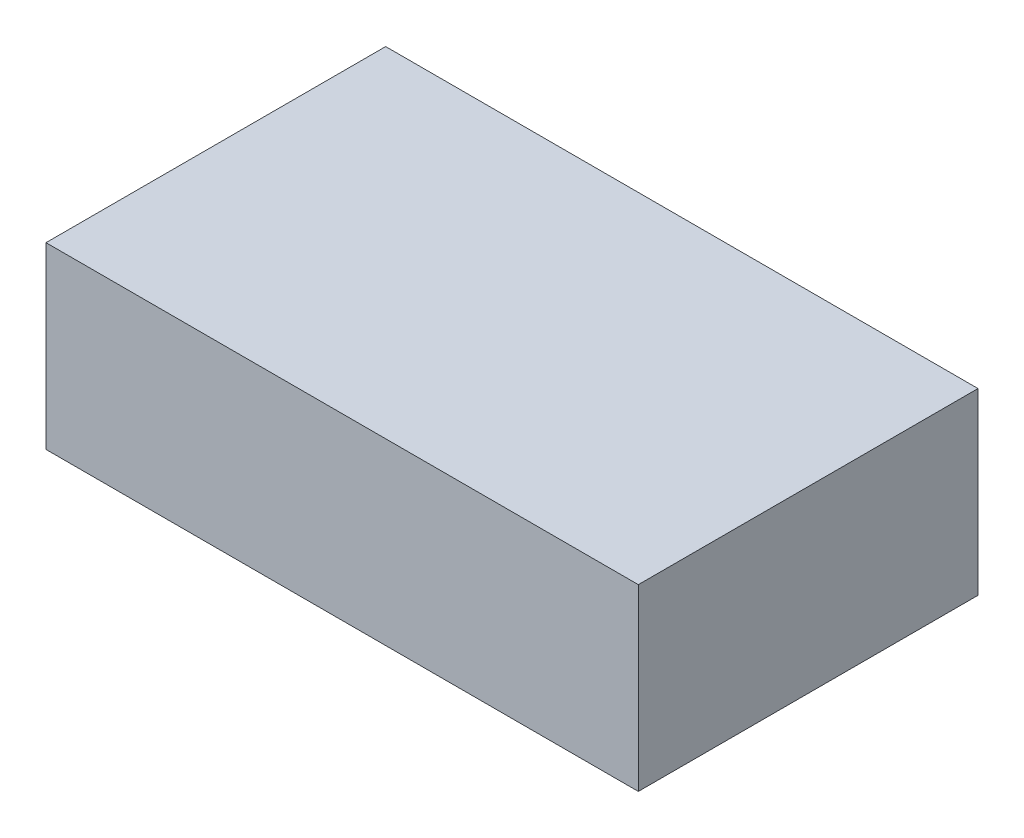
ISO-10303-21;
HEADER;
FILE_DESCRIPTION(('STEP AP214'),'2;1');
FILE_NAME('part.step','',(''),(''),'','','');
FILE_SCHEMA(('AUTOMOTIVE_DESIGN { 1 0 10303 214 1 1 1 1 }'));
ENDSEC;
DATA;
#1=APPLICATION_CONTEXT('core data for automotive mechanical design processes');
#2=APPLICATION_PROTOCOL_DEFINITION('international standard','automotive_design',2000,#1);
#3=PRODUCT_CONTEXT('',#1,'mechanical');
#4=PRODUCT('Part','Part','',(#3));
#5=PRODUCT_RELATED_PRODUCT_CATEGORY('part','',(#4));
#6=PRODUCT_DEFINITION_FORMATION('','',#4);
#7=PRODUCT_DEFINITION_CONTEXT('part definition',#1,'design');
#8=PRODUCT_DEFINITION('design','',#6,#7);
#9=PRODUCT_DEFINITION_SHAPE('','',#8);
#10=(LENGTH_UNIT() NAMED_UNIT(*) SI_UNIT(.MILLI.,.METRE.));
#11=(NAMED_UNIT(*) PLANE_ANGLE_UNIT() SI_UNIT($,.RADIAN.));
#12=(NAMED_UNIT(*) SI_UNIT($,.STERADIAN.) SOLID_ANGLE_UNIT());
#13=UNCERTAINTY_MEASURE_WITH_UNIT(LENGTH_MEASURE(1.E-05),#10,'distance_accuracy_value','');
#14=(GEOMETRIC_REPRESENTATION_CONTEXT(3) GLOBAL_UNCERTAINTY_ASSIGNED_CONTEXT((#13)) GLOBAL_UNIT_ASSIGNED_CONTEXT((#10,
#11,#12)) REPRESENTATION_CONTEXT('',''));
#15=CARTESIAN_POINT('',(0.,0.,0.));
#16=DIRECTION('',(0.,0.,1.));
#17=DIRECTION('',(1.,0.,0.));
#18=AXIS2_PLACEMENT_3D('',#15,#16,#17);
#19=CARTESIAN_POINT('',(23.35,14.12,13.39));
#20=DIRECTION('',(-1.,0.,0.));
#21=DIRECTION('',(0.,0.,1.));
#22=AXIS2_PLACEMENT_3D('',#19,#20,#21);
#23=PLANE('',#22);
#24=DIRECTION('',(0.,0.,-1.));
#25=VECTOR('',#24,1.);
#26=CARTESIAN_POINT('',(23.35,0.,13.39));
#27=LINE('',#26,#25);
#28=CARTESIAN_POINT('',(23.35,0.,13.39));
#29=VERTEX_POINT('',#28);
#30=CARTESIAN_POINT('',(23.35,0.,-13.39));
#31=VERTEX_POINT('',#30);
#32=EDGE_CURVE('E99',#29,#31,#27,.T.);
#33=ORIENTED_EDGE('',*,*,#32,.T.);
#34=DIRECTION('',(0.,-1.,0.));
#35=VECTOR('',#34,1.);
#36=CARTESIAN_POINT('',(23.35,14.12,-13.39));
#37=LINE('',#36,#35);
#38=CARTESIAN_POINT('',(23.35,14.12,-13.39));
#39=VERTEX_POINT('',#38);
#40=EDGE_CURVE('E11',#39,#31,#37,.T.);
#41=ORIENTED_EDGE('',*,*,#40,.F.);
#42=DIRECTION('',(0.,0.,-1.));
#43=VECTOR('',#42,1.);
#44=CARTESIAN_POINT('',(23.35,14.12,13.39));
#45=LINE('',#44,#43);
#46=CARTESIAN_POINT('',(23.35,14.12,13.39));
#47=VERTEX_POINT('',#46);
#48=EDGE_CURVE('E87',#47,#39,#45,.T.);
#49=ORIENTED_EDGE('',*,*,#48,.F.);
#50=DIRECTION('',(0.,-1.,0.));
#51=VECTOR('',#50,1.);
#52=CARTESIAN_POINT('',(23.35,14.12,13.39));
#53=LINE('',#52,#51);
#54=EDGE_CURVE('E95',#47,#29,#53,.T.);
#55=ORIENTED_EDGE('',*,*,#54,.T.);
#56=EDGE_LOOP('',(#33,#41,#49,#55));
#57=FACE_BOUND('',#56,.T.);
#58=ADVANCED_FACE('F36',(#57),#23,.F.);
#59=CARTESIAN_POINT('',(-23.35,14.12,-13.39));
#60=DIRECTION('',(0.,0.,1.));
#61=DIRECTION('',(1.,0.,0.));
#62=AXIS2_PLACEMENT_3D('',#59,#60,#61);
#63=PLANE('',#62);
#64=DIRECTION('',(-1.,0.,0.));
#65=VECTOR('',#64,1.);
#66=CARTESIAN_POINT('',(-23.35,0.,-13.39));
#67=LINE('',#66,#65);
#68=CARTESIAN_POINT('',(-23.35,0.,-13.39));
#69=VERTEX_POINT('',#68);
#70=EDGE_CURVE('E91',#31,#69,#67,.T.);
#71=ORIENTED_EDGE('',*,*,#70,.T.);
#72=DIRECTION('',(0.,-1.,0.));
#73=VECTOR('',#72,1.);
#74=CARTESIAN_POINT('',(-23.35,14.12,-13.39));
#75=LINE('',#74,#73);
#76=CARTESIAN_POINT('',(-23.35,14.12,-13.39));
#77=VERTEX_POINT('',#76);
#78=EDGE_CURVE('E44',#77,#69,#75,.T.);
#79=ORIENTED_EDGE('',*,*,#78,.F.);
#80=DIRECTION('',(-1.,0.,0.));
#81=VECTOR('',#80,1.);
#82=CARTESIAN_POINT('',(-23.35,14.12,-13.39));
#83=LINE('',#82,#81);
#84=EDGE_CURVE('E82',#39,#77,#83,.T.);
#85=ORIENTED_EDGE('',*,*,#84,.F.);
#86=ORIENTED_EDGE('',*,*,#40,.T.);
#87=EDGE_LOOP('',(#71,#79,#85,#86));
#88=FACE_BOUND('',#87,.T.);
#89=ADVANCED_FACE('F90',(#88),#63,.F.);
#90=CARTESIAN_POINT('',(-23.35,14.12,13.39));
#91=DIRECTION('',(1.,0.,0.));
#92=DIRECTION('',(0.,0.,-1.));
#93=AXIS2_PLACEMENT_3D('',#90,#91,#92);
#94=PLANE('',#93);
#95=DIRECTION('',(0.,0.,1.));
#96=VECTOR('',#95,1.);
#97=CARTESIAN_POINT('',(-23.35,0.,13.39));
#98=LINE('',#97,#96);
#99=CARTESIAN_POINT('',(-23.35,0.,13.39));
#100=VERTEX_POINT('',#99);
#101=EDGE_CURVE('E69',#69,#100,#98,.T.);
#102=ORIENTED_EDGE('',*,*,#101,.T.);
#103=DIRECTION('',(0.,-1.,0.));
#104=VECTOR('',#103,1.);
#105=CARTESIAN_POINT('',(-23.35,14.12,13.39));
#106=LINE('',#105,#104);
#107=CARTESIAN_POINT('',(-23.35,14.12,13.39));
#108=VERTEX_POINT('',#107);
#109=EDGE_CURVE('E92',#108,#100,#106,.T.);
#110=ORIENTED_EDGE('',*,*,#109,.F.);
#111=DIRECTION('',(0.,0.,1.));
#112=VECTOR('',#111,1.);
#113=CARTESIAN_POINT('',(-23.35,14.12,13.39));
#114=LINE('',#113,#112);
#115=EDGE_CURVE('E85',#77,#108,#114,.T.);
#116=ORIENTED_EDGE('',*,*,#115,.F.);
#117=ORIENTED_EDGE('',*,*,#78,.T.);
#118=EDGE_LOOP('',(#102,#110,#116,#117));
#119=FACE_BOUND('',#118,.T.);
#120=ADVANCED_FACE('F93',(#119),#94,.F.);
#121=CARTESIAN_POINT('',(-23.35,14.12,13.39));
#122=DIRECTION('',(0.,0.,-1.));
#123=DIRECTION('',(-1.,0.,0.));
#124=AXIS2_PLACEMENT_3D('',#121,#122,#123);
#125=PLANE('',#124);
#126=DIRECTION('',(1.,0.,0.));
#127=VECTOR('',#126,1.);
#128=CARTESIAN_POINT('',(-23.35,0.,13.39));
#129=LINE('',#128,#127);
#130=EDGE_CURVE('E75',#100,#29,#129,.T.);
#131=ORIENTED_EDGE('',*,*,#130,.T.);
#132=ORIENTED_EDGE('',*,*,#54,.F.);
#133=DIRECTION('',(1.,0.,0.));
#134=VECTOR('',#133,1.);
#135=CARTESIAN_POINT('',(-23.35,14.12,13.39));
#136=LINE('',#135,#134);
#137=EDGE_CURVE('E52',#108,#47,#136,.T.);
#138=ORIENTED_EDGE('',*,*,#137,.F.);
#139=ORIENTED_EDGE('',*,*,#109,.T.);
#140=EDGE_LOOP('',(#131,#132,#138,#139));
#141=FACE_BOUND('',#140,.T.);
#142=ADVANCED_FACE('F106',(#141),#125,.F.);
#143=CARTESIAN_POINT('',(0.,14.12,0.));
#144=DIRECTION('',(0.,-1.,0.));
#145=DIRECTION('',(0.,0.,-1.));
#146=AXIS2_PLACEMENT_3D('',#143,#144,#145);
#147=PLANE('',#146);
#148=ORIENTED_EDGE('',*,*,#48,.T.);
#149=ORIENTED_EDGE('',*,*,#84,.T.);
#150=ORIENTED_EDGE('',*,*,#115,.T.);
#151=ORIENTED_EDGE('',*,*,#137,.T.);
#152=EDGE_LOOP('',(#148,#149,#150,#151));
#153=FACE_BOUND('',#152,.T.);
#154=ADVANCED_FACE('F83',(#153),#147,.F.);
#155=CARTESIAN_POINT('',(0.,0.,0.));
#156=DIRECTION('',(0.,-1.,0.));
#157=DIRECTION('',(0.,0.,-1.));
#158=AXIS2_PLACEMENT_3D('',#155,#156,#157);
#159=PLANE('',#158);
#160=ORIENTED_EDGE('',*,*,#32,.F.);
#161=ORIENTED_EDGE('',*,*,#130,.F.);
#162=ORIENTED_EDGE('',*,*,#101,.F.);
#163=ORIENTED_EDGE('',*,*,#70,.F.);
#164=EDGE_LOOP('',(#160,#161,#162,#163));
#165=FACE_BOUND('',#164,.T.);
#166=ADVANCED_FACE('F109',(#165),#159,.T.);
#167=CLOSED_SHELL('',(#58,#89,#120,#142,#154,#166));
#168=MANIFOLD_SOLID_BREP('B2',#167);
#169=ADVANCED_BREP_SHAPE_REPRESENTATION('',(#18,#168),#14);
#170=SHAPE_DEFINITION_REPRESENTATION(#9,#169);
ENDSEC;
END-ISO-10303-21;
